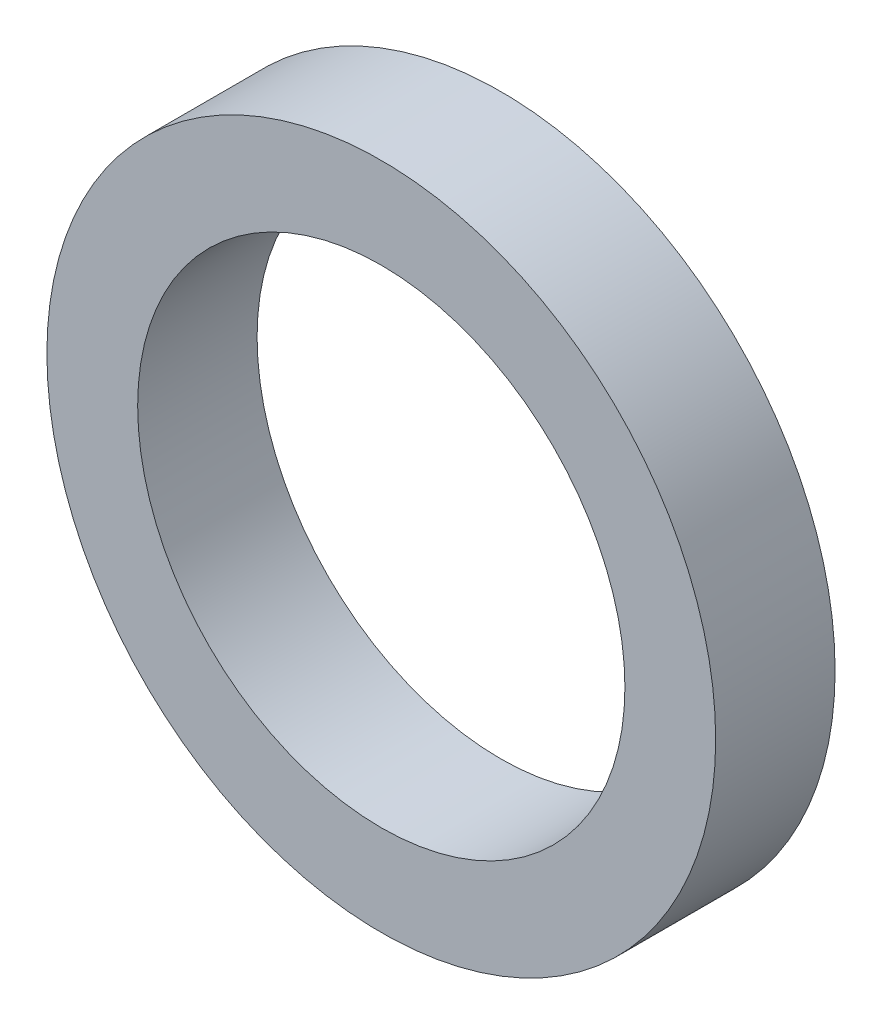
ISO-10303-21;
HEADER;
FILE_DESCRIPTION(('STEP AP214'),'2;1');
FILE_NAME('part.step','',(''),(''),'','','');
FILE_SCHEMA(('AUTOMOTIVE_DESIGN { 1 0 10303 214 1 1 1 1 }'));
ENDSEC;
DATA;
#1=APPLICATION_CONTEXT('core data for automotive mechanical design processes');
#2=APPLICATION_PROTOCOL_DEFINITION('international standard','automotive_design',2000,#1);
#3=PRODUCT_CONTEXT('',#1,'mechanical');
#4=PRODUCT('Part','Part','',(#3));
#5=PRODUCT_RELATED_PRODUCT_CATEGORY('part','',(#4));
#6=PRODUCT_DEFINITION_FORMATION('','',#4);
#7=PRODUCT_DEFINITION_CONTEXT('part definition',#1,'design');
#8=PRODUCT_DEFINITION('design','',#6,#7);
#9=PRODUCT_DEFINITION_SHAPE('','',#8);
#10=(LENGTH_UNIT() NAMED_UNIT(*) SI_UNIT(.MILLI.,.METRE.));
#11=(NAMED_UNIT(*) PLANE_ANGLE_UNIT() SI_UNIT($,.RADIAN.));
#12=(NAMED_UNIT(*) SI_UNIT($,.STERADIAN.) SOLID_ANGLE_UNIT());
#13=UNCERTAINTY_MEASURE_WITH_UNIT(LENGTH_MEASURE(1.E-05),#10,'distance_accuracy_value','');
#14=(GEOMETRIC_REPRESENTATION_CONTEXT(3) GLOBAL_UNCERTAINTY_ASSIGNED_CONTEXT((#13)) GLOBAL_UNIT_ASSIGNED_CONTEXT((#10,
#11,#12)) REPRESENTATION_CONTEXT('',''));
#15=CARTESIAN_POINT('',(0.,0.,0.));
#16=DIRECTION('',(0.,0.,1.));
#17=DIRECTION('',(1.,0.,0.));
#18=AXIS2_PLACEMENT_3D('',#15,#16,#17);
#19=CARTESIAN_POINT('',(0.,0.,0.));
#20=DIRECTION('',(0.,0.,1.));
#21=DIRECTION('',(1.,0.,0.));
#22=AXIS2_PLACEMENT_3D('',#19,#20,#21);
#23=PLANE('',#22);
#24=CARTESIAN_POINT('',(0.,0.,0.));
#25=DIRECTION('',(0.,0.,-1.));
#26=DIRECTION('',(-1.,0.,0.));
#27=AXIS2_PLACEMENT_3D('',#24,#25,#26);
#28=CIRCLE('',#27,5.1);
#29=CARTESIAN_POINT('',(-5.1,0.,0.));
#30=VERTEX_POINT('',#29);
#31=EDGE_CURVE('E27',#30,#30,#28,.F.);
#32=ORIENTED_EDGE('',*,*,#31,.T.);
#33=EDGE_LOOP('',(#32));
#34=FACE_BOUND('',#33,.T.);
#35=CARTESIAN_POINT('',(0.,0.,0.));
#36=DIRECTION('',(0.,0.,-1.));
#37=DIRECTION('',(-1.,0.,0.));
#38=AXIS2_PLACEMENT_3D('',#35,#36,#37);
#39=CIRCLE('',#38,7.);
#40=CARTESIAN_POINT('',(-7.,0.,0.));
#41=VERTEX_POINT('',#40);
#42=EDGE_CURVE('E18',#41,#41,#39,.F.);
#43=ORIENTED_EDGE('',*,*,#42,.F.);
#44=EDGE_LOOP('',(#43));
#45=FACE_BOUND('',#44,.T.);
#46=ADVANCED_FACE('F15',(#34,#45),#23,.F.);
#47=CARTESIAN_POINT('',(0.,0.,2.5));
#48=DIRECTION('',(0.,0.,-1.));
#49=DIRECTION('',(-1.,0.,0.));
#50=AXIS2_PLACEMENT_3D('',#47,#48,#49);
#51=CYLINDRICAL_SURFACE('',#50,7.);
#52=ORIENTED_EDGE('',*,*,#42,.T.);
#53=EDGE_LOOP('',(#52));
#54=FACE_BOUND('',#53,.T.);
#55=CARTESIAN_POINT('',(0.,0.,2.5));
#56=DIRECTION('',(0.,0.,-1.));
#57=DIRECTION('',(-1.,0.,0.));
#58=AXIS2_PLACEMENT_3D('',#55,#56,#57);
#59=CIRCLE('',#58,7.);
#60=CARTESIAN_POINT('',(-7.,0.,2.5));
#61=VERTEX_POINT('',#60);
#62=EDGE_CURVE('E22',#61,#61,#59,.F.);
#63=ORIENTED_EDGE('',*,*,#62,.F.);
#64=EDGE_LOOP('',(#63));
#65=FACE_BOUND('',#64,.T.);
#66=ADVANCED_FACE('F35',(#54,#65),#51,.T.);
#67=CARTESIAN_POINT('',(0.,0.,2.5));
#68=DIRECTION('',(0.,0.,-1.));
#69=DIRECTION('',(-1.,0.,0.));
#70=AXIS2_PLACEMENT_3D('',#67,#68,#69);
#71=CYLINDRICAL_SURFACE('',#70,5.1);
#72=CARTESIAN_POINT('',(0.,0.,2.5));
#73=DIRECTION('',(0.,0.,-1.));
#74=DIRECTION('',(-1.,0.,0.));
#75=AXIS2_PLACEMENT_3D('',#72,#73,#74);
#76=CIRCLE('',#75,5.1);
#77=CARTESIAN_POINT('',(-5.1,0.,2.5));
#78=VERTEX_POINT('',#77);
#79=EDGE_CURVE('E10',#78,#78,#76,.T.);
#80=ORIENTED_EDGE('',*,*,#79,.F.);
#81=EDGE_LOOP('',(#80));
#82=FACE_BOUND('',#81,.T.);
#83=ORIENTED_EDGE('',*,*,#31,.F.);
#84=EDGE_LOOP('',(#83));
#85=FACE_BOUND('',#84,.T.);
#86=ADVANCED_FACE('F43',(#82,#85),#71,.F.);
#87=CARTESIAN_POINT('',(0.,0.,2.5));
#88=DIRECTION('',(0.,0.,1.));
#89=DIRECTION('',(1.,0.,0.));
#90=AXIS2_PLACEMENT_3D('',#87,#88,#89);
#91=PLANE('',#90);
#92=ORIENTED_EDGE('',*,*,#79,.T.);
#93=EDGE_LOOP('',(#92));
#94=FACE_BOUND('',#93,.T.);
#95=ORIENTED_EDGE('',*,*,#62,.T.);
#96=EDGE_LOOP('',(#95));
#97=FACE_BOUND('',#96,.T.);
#98=ADVANCED_FACE('F44',(#94,#97),#91,.T.);
#99=CLOSED_SHELL('',(#46,#66,#86,#98));
#100=MANIFOLD_SOLID_BREP('B1',#99);
#101=ADVANCED_BREP_SHAPE_REPRESENTATION('',(#18,#100),#14);
#102=SHAPE_DEFINITION_REPRESENTATION(#9,#101);
ENDSEC;
END-ISO-10303-21;
